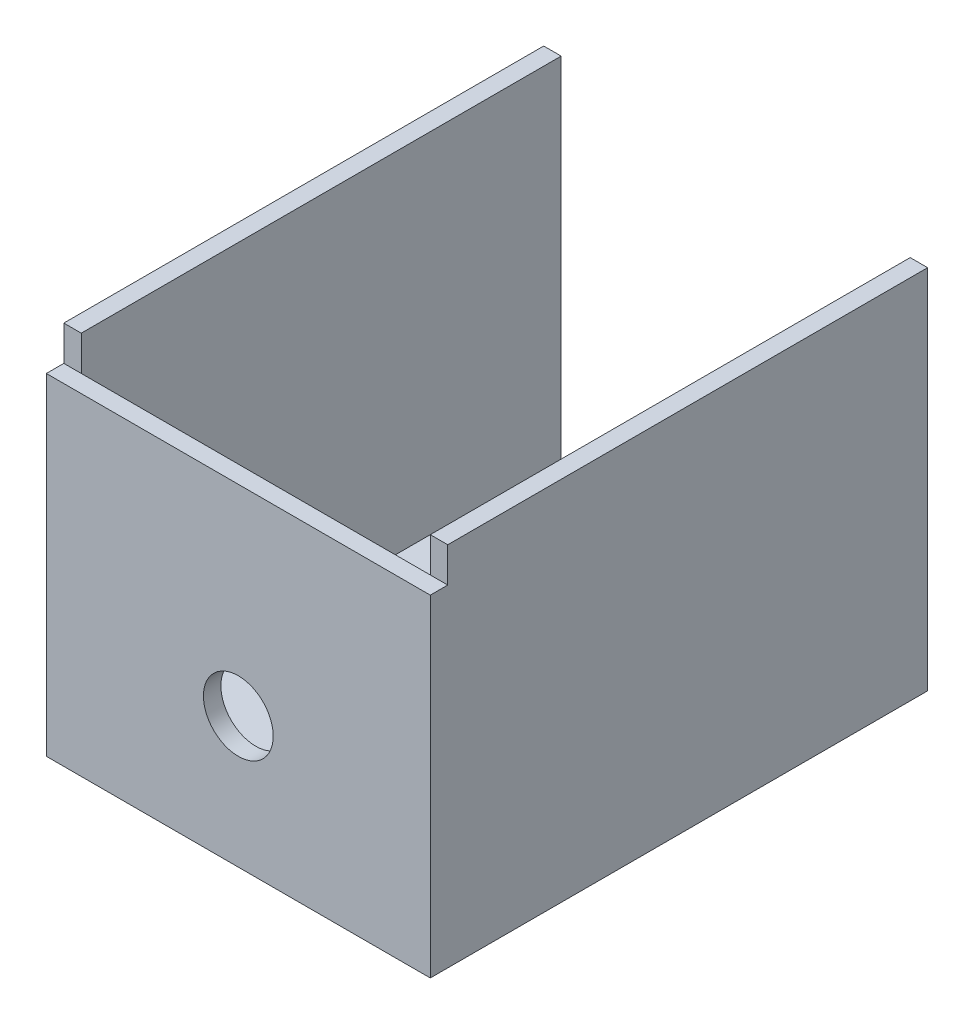
ISO-10303-21;
HEADER;
FILE_DESCRIPTION(('STEP AP214'),'2;1');
FILE_NAME('part.step','',(''),(''),'','','');
FILE_SCHEMA(('AUTOMOTIVE_DESIGN { 1 0 10303 214 1 1 1 1 }'));
ENDSEC;
DATA;
#1=APPLICATION_CONTEXT('core data for automotive mechanical design processes');
#2=APPLICATION_PROTOCOL_DEFINITION('international standard','automotive_design',2000,#1);
#3=PRODUCT_CONTEXT('',#1,'mechanical');
#4=PRODUCT('Part','Part','',(#3));
#5=PRODUCT_RELATED_PRODUCT_CATEGORY('part','',(#4));
#6=PRODUCT_DEFINITION_FORMATION('','',#4);
#7=PRODUCT_DEFINITION_CONTEXT('part definition',#1,'design');
#8=PRODUCT_DEFINITION('design','',#6,#7);
#9=PRODUCT_DEFINITION_SHAPE('','',#8);
#10=(LENGTH_UNIT() NAMED_UNIT(*) SI_UNIT(.MILLI.,.METRE.));
#11=(NAMED_UNIT(*) PLANE_ANGLE_UNIT() SI_UNIT($,.RADIAN.));
#12=(NAMED_UNIT(*) SI_UNIT($,.STERADIAN.) SOLID_ANGLE_UNIT());
#13=UNCERTAINTY_MEASURE_WITH_UNIT(LENGTH_MEASURE(1.E-05),#10,'distance_accuracy_value','');
#14=(GEOMETRIC_REPRESENTATION_CONTEXT(3) GLOBAL_UNCERTAINTY_ASSIGNED_CONTEXT((#13)) GLOBAL_UNIT_ASSIGNED_CONTEXT((#10,
#11,#12)) REPRESENTATION_CONTEXT('',''));
#15=CARTESIAN_POINT('',(0.,0.,0.));
#16=DIRECTION('',(0.,0.,1.));
#17=DIRECTION('',(1.,0.,0.));
#18=AXIS2_PLACEMENT_3D('',#15,#16,#17);
#19=CARTESIAN_POINT('',(0.,0.,55.));
#20=DIRECTION('',(0.,0.,-1.));
#21=DIRECTION('',(-1.,0.,0.));
#22=AXIS2_PLACEMENT_3D('',#19,#20,#21);
#23=PLANE('',#22);
#24=DIRECTION('',(-1.,0.,0.));
#25=VECTOR('',#24,1.);
#26=CARTESIAN_POINT('',(0.,-3.99999999998076,55.));
#27=LINE('',#26,#25);
#28=CARTESIAN_POINT('',(0.,-3.99999999998076,55.));
#29=VERTEX_POINT('',#28);
#30=CARTESIAN_POINT('',(-2.,-3.99999999998076,55.));
#31=VERTEX_POINT('',#30);
#32=EDGE_CURVE('E44',#29,#31,#27,.T.);
#33=ORIENTED_EDGE('',*,*,#32,.F.);
#34=DIRECTION('',(0.,1.,0.));
#35=VECTOR('',#34,1.);
#36=CARTESIAN_POINT('',(0.,0.,55.));
#37=LINE('',#36,#35);
#38=CARTESIAN_POINT('',(0.,0.,55.));
#39=VERTEX_POINT('',#38);
#40=EDGE_CURVE('E141',#29,#39,#37,.T.);
#41=ORIENTED_EDGE('',*,*,#40,.T.);
#42=DIRECTION('',(-1.,0.,0.));
#43=VECTOR('',#42,1.);
#44=CARTESIAN_POINT('',(-2.,0.,55.));
#45=LINE('',#44,#43);
#46=CARTESIAN_POINT('',(-2.,0.,55.));
#47=VERTEX_POINT('',#46);
#48=EDGE_CURVE('E149',#39,#47,#45,.T.);
#49=ORIENTED_EDGE('',*,*,#48,.T.);
#50=DIRECTION('',(0.,-1.,0.));
#51=VECTOR('',#50,1.);
#52=CARTESIAN_POINT('',(-2.,0.,55.));
#53=LINE('',#52,#51);
#54=EDGE_CURVE('E154',#47,#31,#53,.T.);
#55=ORIENTED_EDGE('',*,*,#54,.T.);
#56=EDGE_LOOP('',(#33,#41,#49,#55));
#57=FACE_BOUND('',#56,.T.);
#58=ADVANCED_FACE('F33',(#57),#23,.F.);
#59=CARTESIAN_POINT('',(-42.,-3.99999999998076,55.));
#60=VERTEX_POINT('',#59);
#61=CARTESIAN_POINT('',(-44.,-3.99999999998077,55.));
#62=VERTEX_POINT('',#61);
#63=EDGE_CURVE('E11',#60,#62,#27,.T.);
#64=ORIENTED_EDGE('',*,*,#63,.F.);
#65=DIRECTION('',(0.,1.,0.));
#66=VECTOR('',#65,1.);
#67=CARTESIAN_POINT('',(-42.,-40.,55.));
#68=LINE('',#67,#66);
#69=CARTESIAN_POINT('',(-42.,0.,55.));
#70=VERTEX_POINT('',#69);
#71=EDGE_CURVE('E159',#60,#70,#68,.T.);
#72=ORIENTED_EDGE('',*,*,#71,.T.);
#73=DIRECTION('',(-1.,0.,0.));
#74=VECTOR('',#73,1.);
#75=CARTESIAN_POINT('',(-44.,0.,55.));
#76=LINE('',#75,#74);
#77=CARTESIAN_POINT('',(-44.,0.,55.));
#78=VERTEX_POINT('',#77);
#79=EDGE_CURVE('E163',#70,#78,#76,.T.);
#80=ORIENTED_EDGE('',*,*,#79,.T.);
#81=DIRECTION('',(0.,-1.,0.));
#82=VECTOR('',#81,1.);
#83=CARTESIAN_POINT('',(-44.,-42.,55.));
#84=LINE('',#83,#82);
#85=EDGE_CURVE('E165',#78,#62,#84,.T.);
#86=ORIENTED_EDGE('',*,*,#85,.T.);
#87=EDGE_LOOP('',(#64,#72,#80,#86));
#88=FACE_BOUND('',#87,.T.);
#89=ADVANCED_FACE('F235',(#88),#23,.F.);
#90=CARTESIAN_POINT('',(-2.,0.,55.));
#91=DIRECTION('',(0.,-1.,0.));
#92=DIRECTION('',(1.,0.,0.));
#93=AXIS2_PLACEMENT_3D('',#90,#91,#92);
#94=PLANE('',#93);
#95=DIRECTION('',(-1.,0.,0.));
#96=VECTOR('',#95,1.);
#97=CARTESIAN_POINT('',(-2.,0.,0.));
#98=LINE('',#97,#96);
#99=CARTESIAN_POINT('',(0.,0.,0.));
#100=VERTEX_POINT('',#99);
#101=CARTESIAN_POINT('',(-2.,0.,0.));
#102=VERTEX_POINT('',#101);
#103=EDGE_CURVE('E142',#100,#102,#98,.T.);
#104=ORIENTED_EDGE('',*,*,#103,.T.);
#105=DIRECTION('',(0.,0.,-1.));
#106=VECTOR('',#105,1.);
#107=CARTESIAN_POINT('',(-2.,0.,55.));
#108=LINE('',#107,#106);
#109=EDGE_CURVE('E42',#47,#102,#108,.T.);
#110=ORIENTED_EDGE('',*,*,#109,.F.);
#111=ORIENTED_EDGE('',*,*,#48,.F.);
#112=DIRECTION('',(0.,0.,-1.));
#113=VECTOR('',#112,1.);
#114=CARTESIAN_POINT('',(0.,0.,55.));
#115=LINE('',#114,#113);
#116=EDGE_CURVE('E167',#39,#100,#115,.T.);
#117=ORIENTED_EDGE('',*,*,#116,.T.);
#118=EDGE_LOOP('',(#104,#110,#111,#117));
#119=FACE_BOUND('',#118,.T.);
#120=ADVANCED_FACE('F35',(#119),#94,.F.);
#121=CARTESIAN_POINT('',(-2.,0.,55.));
#122=DIRECTION('',(1.,0.,0.));
#123=DIRECTION('',(0.,1.,0.));
#124=AXIS2_PLACEMENT_3D('',#121,#122,#123);
#125=PLANE('',#124);
#126=DIRECTION('',(0.,-1.,0.));
#127=VECTOR('',#126,1.);
#128=CARTESIAN_POINT('',(-2.,0.,0.));
#129=LINE('',#128,#127);
#130=CARTESIAN_POINT('',(-2.,-40.,0.));
#131=VERTEX_POINT('',#130);
#132=EDGE_CURVE('E145',#102,#131,#129,.T.);
#133=ORIENTED_EDGE('',*,*,#132,.T.);
#134=DIRECTION('',(0.,0.,-1.));
#135=VECTOR('',#134,1.);
#136=CARTESIAN_POINT('',(-2.,-40.,55.));
#137=LINE('',#136,#135);
#138=CARTESIAN_POINT('',(-2.,-40.,55.));
#139=VERTEX_POINT('',#138);
#140=EDGE_CURVE('E197',#139,#131,#137,.T.);
#141=ORIENTED_EDGE('',*,*,#140,.F.);
#142=EDGE_CURVE('E152',#31,#139,#53,.T.);
#143=ORIENTED_EDGE('',*,*,#142,.F.);
#144=ORIENTED_EDGE('',*,*,#54,.F.);
#145=ORIENTED_EDGE('',*,*,#109,.T.);
#146=EDGE_LOOP('',(#133,#141,#143,#144,#145));
#147=FACE_BOUND('',#146,.T.);
#148=ADVANCED_FACE('F202',(#147),#125,.F.);
#149=CARTESIAN_POINT('',(-2.,-40.,55.));
#150=DIRECTION('',(0.,-1.,0.));
#151=DIRECTION('',(1.,0.,0.));
#152=AXIS2_PLACEMENT_3D('',#149,#150,#151);
#153=PLANE('',#152);
#154=DIRECTION('',(-1.,0.,0.));
#155=VECTOR('',#154,1.);
#156=CARTESIAN_POINT('',(-2.,-40.,0.));
#157=LINE('',#156,#155);
#158=CARTESIAN_POINT('',(-42.,-40.,0.));
#159=VERTEX_POINT('',#158);
#160=EDGE_CURVE('E170',#131,#159,#157,.T.);
#161=ORIENTED_EDGE('',*,*,#160,.T.);
#162=DIRECTION('',(0.,0.,-1.));
#163=VECTOR('',#162,1.);
#164=CARTESIAN_POINT('',(-42.,-40.,55.));
#165=LINE('',#164,#163);
#166=CARTESIAN_POINT('',(-42.,-40.,55.));
#167=VERTEX_POINT('',#166);
#168=EDGE_CURVE('E194',#167,#159,#165,.T.);
#169=ORIENTED_EDGE('',*,*,#168,.F.);
#170=DIRECTION('',(-1.,0.,0.));
#171=VECTOR('',#170,1.);
#172=CARTESIAN_POINT('',(-2.,-40.,55.));
#173=LINE('',#172,#171);
#174=EDGE_CURVE('E156',#139,#167,#173,.T.);
#175=ORIENTED_EDGE('',*,*,#174,.F.);
#176=ORIENTED_EDGE('',*,*,#140,.T.);
#177=EDGE_LOOP('',(#161,#169,#175,#176));
#178=FACE_BOUND('',#177,.T.);
#179=ADVANCED_FACE('F214',(#178),#153,.F.);
#180=CARTESIAN_POINT('',(-42.,-40.,55.));
#181=DIRECTION('',(-1.,0.,0.));
#182=DIRECTION('',(0.,0.,1.));
#183=AXIS2_PLACEMENT_3D('',#180,#181,#182);
#184=PLANE('',#183);
#185=DIRECTION('',(0.,1.,0.));
#186=VECTOR('',#185,1.);
#187=CARTESIAN_POINT('',(-42.,-40.,0.));
#188=LINE('',#187,#186);
#189=CARTESIAN_POINT('',(-42.,0.,0.));
#190=VERTEX_POINT('',#189);
#191=EDGE_CURVE('E172',#159,#190,#188,.T.);
#192=ORIENTED_EDGE('',*,*,#191,.T.);
#193=DIRECTION('',(0.,0.,-1.));
#194=VECTOR('',#193,1.);
#195=CARTESIAN_POINT('',(-42.,0.,55.));
#196=LINE('',#195,#194);
#197=EDGE_CURVE('E191',#70,#190,#196,.T.);
#198=ORIENTED_EDGE('',*,*,#197,.F.);
#199=ORIENTED_EDGE('',*,*,#71,.F.);
#200=EDGE_CURVE('E160',#167,#60,#68,.T.);
#201=ORIENTED_EDGE('',*,*,#200,.F.);
#202=ORIENTED_EDGE('',*,*,#168,.T.);
#203=EDGE_LOOP('',(#192,#198,#199,#201,#202));
#204=FACE_BOUND('',#203,.T.);
#205=ADVANCED_FACE('F218',(#204),#184,.F.);
#206=CARTESIAN_POINT('',(-44.,0.,55.));
#207=DIRECTION('',(0.,-1.,0.));
#208=DIRECTION('',(0.,0.,-1.));
#209=AXIS2_PLACEMENT_3D('',#206,#207,#208);
#210=PLANE('',#209);
#211=DIRECTION('',(-1.,0.,0.));
#212=VECTOR('',#211,1.);
#213=CARTESIAN_POINT('',(-44.,0.,0.));
#214=LINE('',#213,#212);
#215=CARTESIAN_POINT('',(-44.,0.,0.));
#216=VERTEX_POINT('',#215);
#217=EDGE_CURVE('E174',#190,#216,#214,.T.);
#218=ORIENTED_EDGE('',*,*,#217,.T.);
#219=DIRECTION('',(0.,0.,-1.));
#220=VECTOR('',#219,1.);
#221=CARTESIAN_POINT('',(-44.,0.,55.));
#222=LINE('',#221,#220);
#223=EDGE_CURVE('E188',#78,#216,#222,.T.);
#224=ORIENTED_EDGE('',*,*,#223,.F.);
#225=ORIENTED_EDGE('',*,*,#79,.F.);
#226=ORIENTED_EDGE('',*,*,#197,.T.);
#227=EDGE_LOOP('',(#218,#224,#225,#226));
#228=FACE_BOUND('',#227,.T.);
#229=ADVANCED_FACE('F234',(#228),#210,.F.);
#230=CARTESIAN_POINT('',(-44.,-42.,55.));
#231=DIRECTION('',(1.,0.,0.));
#232=DIRECTION('',(0.,1.,0.));
#233=AXIS2_PLACEMENT_3D('',#230,#231,#232);
#234=PLANE('',#233);
#235=DIRECTION('',(0.,-1.,0.));
#236=VECTOR('',#235,1.);
#237=CARTESIAN_POINT('',(-44.,-42.,0.));
#238=LINE('',#237,#236);
#239=CARTESIAN_POINT('',(-44.,-42.,0.));
#240=VERTEX_POINT('',#239);
#241=EDGE_CURVE('E176',#216,#240,#238,.T.);
#242=ORIENTED_EDGE('',*,*,#241,.T.);
#243=DIRECTION('',(0.,0.,-1.));
#244=VECTOR('',#243,1.);
#245=CARTESIAN_POINT('',(-44.,-42.,55.));
#246=LINE('',#245,#244);
#247=CARTESIAN_POINT('',(-44.,-42.,57.));
#248=VERTEX_POINT('',#247);
#249=EDGE_CURVE('E185',#248,#240,#246,.T.);
#250=ORIENTED_EDGE('',*,*,#249,.F.);
#251=DIRECTION('',(0.,-1.,0.));
#252=VECTOR('',#251,1.);
#253=CARTESIAN_POINT('',(-44.,-42.,57.));
#254=LINE('',#253,#252);
#255=CARTESIAN_POINT('',(-44.,-3.99999999998077,57.));
#256=VERTEX_POINT('',#255);
#257=EDGE_CURVE('E128',#256,#248,#254,.T.);
#258=ORIENTED_EDGE('',*,*,#257,.F.);
#259=DIRECTION('',(0.,0.,-1.));
#260=VECTOR('',#259,1.);
#261=CARTESIAN_POINT('',(-44.,-3.99999999998077,57.));
#262=LINE('',#261,#260);
#263=EDGE_CURVE('E124',#256,#62,#262,.T.);
#264=ORIENTED_EDGE('',*,*,#263,.T.);
#265=ORIENTED_EDGE('',*,*,#85,.F.);
#266=ORIENTED_EDGE('',*,*,#223,.T.);
#267=EDGE_LOOP('',(#242,#250,#258,#264,#265,#266));
#268=FACE_BOUND('',#267,.T.);
#269=ADVANCED_FACE('F229',(#268),#234,.F.);
#270=CARTESIAN_POINT('',(0.,-42.,55.));
#271=DIRECTION('',(0.,1.,0.));
#272=DIRECTION('',(-1.,0.,0.));
#273=AXIS2_PLACEMENT_3D('',#270,#271,#272);
#274=PLANE('',#273);
#275=DIRECTION('',(1.,0.,0.));
#276=VECTOR('',#275,1.);
#277=CARTESIAN_POINT('',(0.,-42.,0.));
#278=LINE('',#277,#276);
#279=CARTESIAN_POINT('',(0.,-42.,0.));
#280=VERTEX_POINT('',#279);
#281=EDGE_CURVE('E178',#240,#280,#278,.T.);
#282=ORIENTED_EDGE('',*,*,#281,.T.);
#283=DIRECTION('',(0.,0.,-1.));
#284=VECTOR('',#283,1.);
#285=CARTESIAN_POINT('',(0.,-42.,55.));
#286=LINE('',#285,#284);
#287=CARTESIAN_POINT('',(0.,-42.,57.));
#288=VERTEX_POINT('',#287);
#289=EDGE_CURVE('E183',#288,#280,#286,.T.);
#290=ORIENTED_EDGE('',*,*,#289,.F.);
#291=DIRECTION('',(1.,0.,0.));
#292=VECTOR('',#291,1.);
#293=CARTESIAN_POINT('',(0.,-42.,57.));
#294=LINE('',#293,#292);
#295=EDGE_CURVE('E135',#248,#288,#294,.T.);
#296=ORIENTED_EDGE('',*,*,#295,.F.);
#297=ORIENTED_EDGE('',*,*,#249,.T.);
#298=EDGE_LOOP('',(#282,#290,#296,#297));
#299=FACE_BOUND('',#298,.T.);
#300=ADVANCED_FACE('F226',(#299),#274,.F.);
#301=CARTESIAN_POINT('',(0.,0.,55.));
#302=DIRECTION('',(-1.,0.,0.));
#303=DIRECTION('',(0.,-1.,0.));
#304=AXIS2_PLACEMENT_3D('',#301,#302,#303);
#305=PLANE('',#304);
#306=DIRECTION('',(0.,1.,0.));
#307=VECTOR('',#306,1.);
#308=CARTESIAN_POINT('',(0.,0.,0.));
#309=LINE('',#308,#307);
#310=EDGE_CURVE('E153',#280,#100,#309,.T.);
#311=ORIENTED_EDGE('',*,*,#310,.T.);
#312=ORIENTED_EDGE('',*,*,#116,.F.);
#313=ORIENTED_EDGE('',*,*,#40,.F.);
#314=DIRECTION('',(0.,0.,-1.));
#315=VECTOR('',#314,1.);
#316=CARTESIAN_POINT('',(0.,-3.99999999998076,57.));
#317=LINE('',#316,#315);
#318=CARTESIAN_POINT('',(0.,-3.99999999998076,57.));
#319=VERTEX_POINT('',#318);
#320=EDGE_CURVE('E122',#319,#29,#317,.T.);
#321=ORIENTED_EDGE('',*,*,#320,.F.);
#322=DIRECTION('',(0.,1.,0.));
#323=VECTOR('',#322,1.);
#324=CARTESIAN_POINT('',(0.,-42.,57.));
#325=LINE('',#324,#323);
#326=EDGE_CURVE('E129',#288,#319,#325,.T.);
#327=ORIENTED_EDGE('',*,*,#326,.F.);
#328=ORIENTED_EDGE('',*,*,#289,.T.);
#329=EDGE_LOOP('',(#311,#312,#313,#321,#327,#328));
#330=FACE_BOUND('',#329,.T.);
#331=ADVANCED_FACE('F139',(#330),#305,.F.);
#332=CARTESIAN_POINT('',(0.,0.,0.));
#333=DIRECTION('',(0.,0.,-1.));
#334=DIRECTION('',(-1.,0.,0.));
#335=AXIS2_PLACEMENT_3D('',#332,#333,#334);
#336=PLANE('',#335);
#337=ORIENTED_EDGE('',*,*,#103,.F.);
#338=ORIENTED_EDGE('',*,*,#310,.F.);
#339=ORIENTED_EDGE('',*,*,#281,.F.);
#340=ORIENTED_EDGE('',*,*,#241,.F.);
#341=ORIENTED_EDGE('',*,*,#217,.F.);
#342=ORIENTED_EDGE('',*,*,#191,.F.);
#343=ORIENTED_EDGE('',*,*,#160,.F.);
#344=ORIENTED_EDGE('',*,*,#132,.F.);
#345=EDGE_LOOP('',(#337,#338,#339,#340,#341,#342,#343,#344));
#346=FACE_BOUND('',#345,.T.);
#347=ADVANCED_FACE('F208',(#346),#336,.T.);
#348=CARTESIAN_POINT('',(0.,0.,55.));
#349=DIRECTION('',(0.,0.,1.));
#350=DIRECTION('',(1.,0.,0.));
#351=AXIS2_PLACEMENT_3D('',#348,#349,#350);
#352=PLANE('',#351);
#353=CARTESIAN_POINT('',(-22.0000000000007,-26.9999999999808,55.));
#354=DIRECTION('',(0.,0.,1.));
#355=DIRECTION('',(1.,0.,0.));
#356=AXIS2_PLACEMENT_3D('',#353,#354,#355);
#357=CIRCLE('',#356,4.00000000000086);
#358=CARTESIAN_POINT('',(-17.9999999999998,-26.9999999999808,55.));
#359=VERTEX_POINT('',#358);
#360=EDGE_CURVE('E238',#359,#359,#357,.T.);
#361=ORIENTED_EDGE('',*,*,#360,.T.);
#362=EDGE_LOOP('',(#361));
#363=FACE_BOUND('',#362,.T.);
#364=EDGE_CURVE('E45',#31,#60,#27,.T.);
#365=ORIENTED_EDGE('',*,*,#364,.F.);
#366=ORIENTED_EDGE('',*,*,#142,.T.);
#367=ORIENTED_EDGE('',*,*,#174,.T.);
#368=ORIENTED_EDGE('',*,*,#200,.T.);
#369=EDGE_LOOP('',(#365,#366,#367,#368));
#370=FACE_BOUND('',#369,.T.);
#371=ADVANCED_FACE('F224',(#363,#370),#352,.F.);
#372=CARTESIAN_POINT('',(0.,-3.99999999998076,57.));
#373=DIRECTION('',(0.,-1.,0.));
#374=DIRECTION('',(1.,0.,0.));
#375=AXIS2_PLACEMENT_3D('',#372,#373,#374);
#376=PLANE('',#375);
#377=ORIENTED_EDGE('',*,*,#32,.T.);
#378=ORIENTED_EDGE('',*,*,#364,.T.);
#379=ORIENTED_EDGE('',*,*,#63,.T.);
#380=ORIENTED_EDGE('',*,*,#263,.F.);
#381=DIRECTION('',(-1.,0.,0.));
#382=VECTOR('',#381,1.);
#383=CARTESIAN_POINT('',(0.,-3.99999999998076,57.));
#384=LINE('',#383,#382);
#385=EDGE_CURVE('E118',#319,#256,#384,.T.);
#386=ORIENTED_EDGE('',*,*,#385,.F.);
#387=ORIENTED_EDGE('',*,*,#320,.T.);
#388=EDGE_LOOP('',(#377,#378,#379,#380,#386,#387));
#389=FACE_BOUND('',#388,.T.);
#390=ADVANCED_FACE('F120',(#389),#376,.F.);
#391=CARTESIAN_POINT('',(0.,0.,57.));
#392=DIRECTION('',(0.,0.,1.));
#393=DIRECTION('',(1.,0.,0.));
#394=AXIS2_PLACEMENT_3D('',#391,#392,#393);
#395=PLANE('',#394);
#396=CARTESIAN_POINT('',(-22.0000000000007,-26.9999999999808,57.));
#397=DIRECTION('',(0.,0.,1.));
#398=DIRECTION('',(1.,0.,0.));
#399=AXIS2_PLACEMENT_3D('',#396,#397,#398);
#400=CIRCLE('',#399,4.00000000000086);
#401=CARTESIAN_POINT('',(-17.9999999999998,-26.9999999999808,57.));
#402=VERTEX_POINT('',#401);
#403=EDGE_CURVE('E37',#402,#402,#400,.T.);
#404=ORIENTED_EDGE('',*,*,#403,.F.);
#405=EDGE_LOOP('',(#404));
#406=FACE_BOUND('',#405,.T.);
#407=ORIENTED_EDGE('',*,*,#326,.T.);
#408=ORIENTED_EDGE('',*,*,#385,.T.);
#409=ORIENTED_EDGE('',*,*,#257,.T.);
#410=ORIENTED_EDGE('',*,*,#295,.T.);
#411=EDGE_LOOP('',(#407,#408,#409,#410));
#412=FACE_BOUND('',#411,.T.);
#413=ADVANCED_FACE('F133',(#406,#412),#395,.T.);
#414=CARTESIAN_POINT('',(-22.0000000000007,-26.9999999999808,0.));
#415=DIRECTION('',(0.,0.,1.));
#416=DIRECTION('',(1.,0.,0.));
#417=AXIS2_PLACEMENT_3D('',#414,#415,#416);
#418=CYLINDRICAL_SURFACE('',#417,4.00000000000086);
#419=CARTESIAN_POINT('',(-17.9999999999998,-26.9999999999808,57.));
#420=CARTESIAN_POINT('',(-17.9999999999998,-26.9999999999808,56.9791666666667));
#421=CARTESIAN_POINT('',(-17.9999999999998,-26.9999999999808,56.9583333333333));
#422=CARTESIAN_POINT('',(-17.9999999999998,-26.9999999999808,56.9166666666667));
#423=CARTESIAN_POINT('',(-17.9999999999998,-26.9999999999808,56.8958333333333));
#424=CARTESIAN_POINT('',(-17.9999999999998,-26.9999999999808,56.8541666666667));
#425=CARTESIAN_POINT('',(-17.9999999999998,-26.9999999999808,56.8333333333333));
#426=CARTESIAN_POINT('',(-17.9999999999998,-26.9999999999808,56.7916666666667));
#427=CARTESIAN_POINT('',(-17.9999999999998,-26.9999999999808,56.7708333333333));
#428=CARTESIAN_POINT('',(-17.9999999999998,-26.9999999999808,56.7291666666667));
#429=CARTESIAN_POINT('',(-17.9999999999998,-26.9999999999808,56.7083333333333));
#430=CARTESIAN_POINT('',(-17.9999999999998,-26.9999999999808,56.6666666666667));
#431=CARTESIAN_POINT('',(-17.9999999999998,-26.9999999999808,56.6458333333333));
#432=CARTESIAN_POINT('',(-17.9999999999998,-26.9999999999808,56.6041666666667));
#433=CARTESIAN_POINT('',(-17.9999999999998,-26.9999999999808,56.5833333333333));
#434=CARTESIAN_POINT('',(-17.9999999999998,-26.9999999999808,56.5416666666667));
#435=CARTESIAN_POINT('',(-17.9999999999998,-26.9999999999808,56.5208333333333));
#436=CARTESIAN_POINT('',(-17.9999999999998,-26.9999999999808,56.4791666666667));
#437=CARTESIAN_POINT('',(-17.9999999999998,-26.9999999999808,56.4583333333333));
#438=CARTESIAN_POINT('',(-17.9999999999998,-26.9999999999808,56.4166666666667));
#439=CARTESIAN_POINT('',(-17.9999999999998,-26.9999999999808,56.3958333333333));
#440=CARTESIAN_POINT('',(-17.9999999999998,-26.9999999999808,56.3541666666667));
#441=CARTESIAN_POINT('',(-17.9999999999998,-26.9999999999808,56.3333333333333));
#442=CARTESIAN_POINT('',(-17.9999999999998,-26.9999999999808,56.2916666666667));
#443=CARTESIAN_POINT('',(-17.9999999999998,-26.9999999999808,56.2708333333333));
#444=CARTESIAN_POINT('',(-17.9999999999998,-26.9999999999808,56.2291666666667));
#445=CARTESIAN_POINT('',(-17.9999999999998,-26.9999999999808,56.2083333333333));
#446=CARTESIAN_POINT('',(-17.9999999999998,-26.9999999999808,56.1666666666667));
#447=CARTESIAN_POINT('',(-17.9999999999998,-26.9999999999808,56.1458333333333));
#448=CARTESIAN_POINT('',(-17.9999999999998,-26.9999999999808,56.1041666666667));
#449=CARTESIAN_POINT('',(-17.9999999999998,-26.9999999999808,56.0833333333333));
#450=CARTESIAN_POINT('',(-17.9999999999998,-26.9999999999808,56.0416666666667));
#451=CARTESIAN_POINT('',(-17.9999999999998,-26.9999999999808,56.0208333333333));
#452=CARTESIAN_POINT('',(-17.9999999999998,-26.9999999999808,55.9791666666667));
#453=CARTESIAN_POINT('',(-17.9999999999998,-26.9999999999808,55.9583333333333));
#454=CARTESIAN_POINT('',(-17.9999999999998,-26.9999999999808,55.9166666666667));
#455=CARTESIAN_POINT('',(-17.9999999999998,-26.9999999999808,55.8958333333333));
#456=CARTESIAN_POINT('',(-17.9999999999998,-26.9999999999808,55.8541666666667));
#457=CARTESIAN_POINT('',(-17.9999999999998,-26.9999999999808,55.8333333333333));
#458=CARTESIAN_POINT('',(-17.9999999999998,-26.9999999999808,55.7916666666667));
#459=CARTESIAN_POINT('',(-17.9999999999998,-26.9999999999808,55.7708333333333));
#460=CARTESIAN_POINT('',(-17.9999999999998,-26.9999999999808,55.7291666666667));
#461=CARTESIAN_POINT('',(-17.9999999999998,-26.9999999999808,55.7083333333333));
#462=CARTESIAN_POINT('',(-17.9999999999998,-26.9999999999808,55.6666666666667));
#463=CARTESIAN_POINT('',(-17.9999999999998,-26.9999999999808,55.6458333333333));
#464=CARTESIAN_POINT('',(-17.9999999999998,-26.9999999999808,55.6041666666667));
#465=CARTESIAN_POINT('',(-17.9999999999998,-26.9999999999808,55.5833333333333));
#466=CARTESIAN_POINT('',(-17.9999999999998,-26.9999999999808,55.5416666666667));
#467=CARTESIAN_POINT('',(-17.9999999999998,-26.9999999999808,55.5208333333333));
#468=CARTESIAN_POINT('',(-17.9999999999998,-26.9999999999808,55.4791666666667));
#469=CARTESIAN_POINT('',(-17.9999999999998,-26.9999999999808,55.4583333333333));
#470=CARTESIAN_POINT('',(-17.9999999999998,-26.9999999999808,55.4166666666667));
#471=CARTESIAN_POINT('',(-17.9999999999998,-26.9999999999808,55.3958333333333));
#472=CARTESIAN_POINT('',(-17.9999999999998,-26.9999999999808,55.3541666666667));
#473=CARTESIAN_POINT('',(-17.9999999999998,-26.9999999999808,55.3333333333333));
#474=CARTESIAN_POINT('',(-17.9999999999998,-26.9999999999808,55.2916666666667));
#475=CARTESIAN_POINT('',(-17.9999999999998,-26.9999999999808,55.2708333333333));
#476=CARTESIAN_POINT('',(-17.9999999999998,-26.9999999999808,55.2291666666667));
#477=CARTESIAN_POINT('',(-17.9999999999998,-26.9999999999808,55.2083333333333));
#478=CARTESIAN_POINT('',(-17.9999999999998,-26.9999999999808,55.1666666666667));
#479=CARTESIAN_POINT('',(-17.9999999999998,-26.9999999999808,55.1458333333333));
#480=CARTESIAN_POINT('',(-17.9999999999998,-26.9999999999808,55.1041666666667));
#481=CARTESIAN_POINT('',(-17.9999999999998,-26.9999999999808,55.0833333333333));
#482=CARTESIAN_POINT('',(-17.9999999999998,-26.9999999999808,55.0416666666667));
#483=CARTESIAN_POINT('',(-17.9999999999998,-26.9999999999808,55.0208333333333));
#484=CARTESIAN_POINT('',(-17.9999999999998,-26.9999999999808,55.));
#485=B_SPLINE_CURVE_WITH_KNOTS('',3,(#419,#420,#421,#422,#423,#424,#425,#426,#427,#428,#429,
#430,#431,#432,#433,#434,#435,#436,#437,#438,#439,#440,#441,#442,#443,#444,#445,#446,#447,#448,
#449,#450,#451,#452,#453,#454,#455,#456,#457,#458,#459,#460,#461,#462,#463,#464,#465,#466,#467,
#468,#469,#470,#471,#472,#473,#474,#475,#476,#477,#478,#479,#480,#481,#482,#483,#484),
.UNSPECIFIED.,.F.,.F.,(4,2,2,2,2,2,2,2,2,2,2,2,2,2,2,2,2,2,2,2,2,2,2,2,2,2,2,2,2,2,2,2,4),(0.,
0.0625000000000001,0.125,0.1875,0.25,0.3125,0.375,0.4375,0.5,0.5625,0.625000000000001,
0.687500000000001,0.750000000000001,0.812500000000001,0.875000000000001,0.937500000000001,1.,
1.0625,1.125,1.1875,1.25,1.3125,1.375,1.4375,1.5,1.5625,1.625,1.6875,1.75,1.8125,1.875,1.9375,
2.),.UNSPECIFIED.);
#486=EDGE_CURVE('BSEAM246',#402,#359,#485,.T.);
#487=ORIENTED_EDGE('',*,*,#403,.T.);
#488=ORIENTED_EDGE('',*,*,#360,.F.);
#489=ORIENTED_EDGE('',*,*,#486,.T.);
#490=ORIENTED_EDGE('',*,*,#486,.F.);
#491=EDGE_LOOP('',(#487,#489,#488,#490));
#492=FACE_BOUND('',#491,.T.);
#493=ADVANCED_FACE('F246',(#492),#418,.F.);
#494=CLOSED_SHELL('',(#58,#89,#120,#148,#179,#205,#229,#269,#300,#331,#347,#371,#390,#413,#493));
#495=MANIFOLD_SOLID_BREP('B2',#494);
#496=ADVANCED_BREP_SHAPE_REPRESENTATION('',(#18,#495),#14);
#497=SHAPE_DEFINITION_REPRESENTATION(#9,#496);
ENDSEC;
END-ISO-10303-21;
